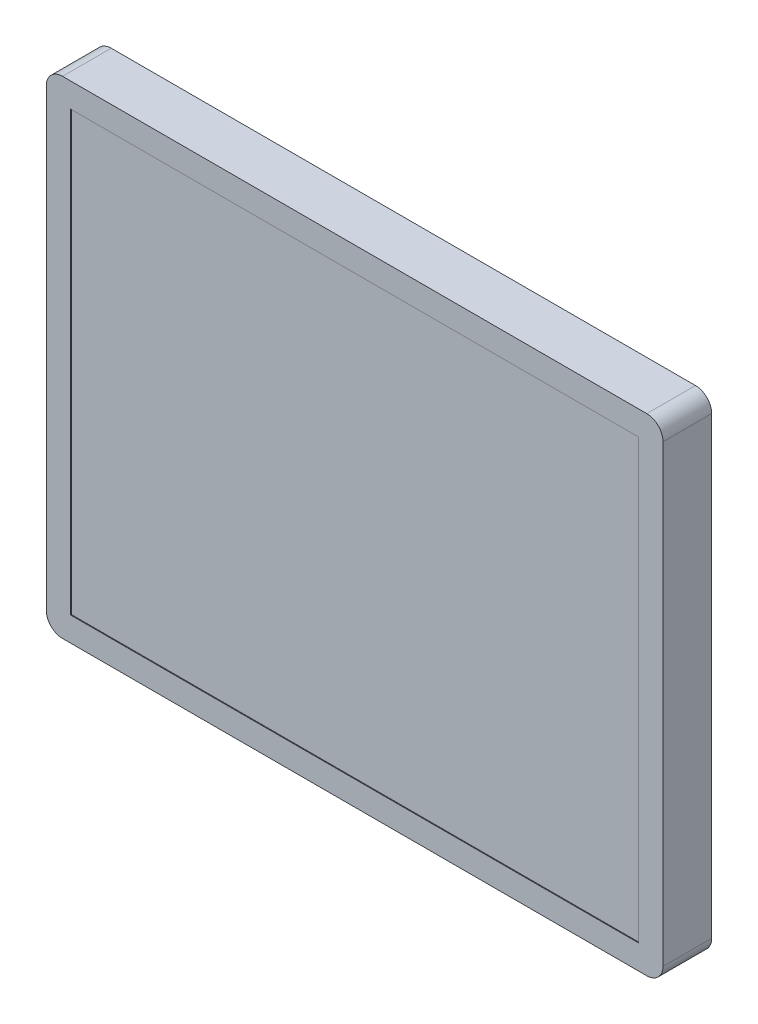
ISO-10303-21;
HEADER;
FILE_DESCRIPTION(('STEP AP214'),'2;1');
FILE_NAME('part.step','',(''),(''),'','','');
FILE_SCHEMA(('AUTOMOTIVE_DESIGN { 1 0 10303 214 1 1 1 1 }'));
ENDSEC;
DATA;
#1=APPLICATION_CONTEXT('core data for automotive mechanical design processes');
#2=APPLICATION_PROTOCOL_DEFINITION('international standard','automotive_design',2000,#1);
#3=PRODUCT_CONTEXT('',#1,'mechanical');
#4=PRODUCT('Part','Part','',(#3));
#5=PRODUCT_RELATED_PRODUCT_CATEGORY('part','',(#4));
#6=PRODUCT_DEFINITION_FORMATION('','',#4);
#7=PRODUCT_DEFINITION_CONTEXT('part definition',#1,'design');
#8=PRODUCT_DEFINITION('design','',#6,#7);
#9=PRODUCT_DEFINITION_SHAPE('','',#8);
#10=(LENGTH_UNIT() NAMED_UNIT(*) SI_UNIT(.MILLI.,.METRE.));
#11=(NAMED_UNIT(*) PLANE_ANGLE_UNIT() SI_UNIT($,.RADIAN.));
#12=(NAMED_UNIT(*) SI_UNIT($,.STERADIAN.) SOLID_ANGLE_UNIT());
#13=UNCERTAINTY_MEASURE_WITH_UNIT(LENGTH_MEASURE(1.E-05),#10,'distance_accuracy_value','');
#14=(GEOMETRIC_REPRESENTATION_CONTEXT(3) GLOBAL_UNCERTAINTY_ASSIGNED_CONTEXT((#13)) GLOBAL_UNIT_ASSIGNED_CONTEXT((#10,
#11,#12)) REPRESENTATION_CONTEXT('',''));
#15=CARTESIAN_POINT('',(0.,0.,0.));
#16=DIRECTION('',(0.,0.,1.));
#17=DIRECTION('',(1.,0.,0.));
#18=AXIS2_PLACEMENT_3D('',#15,#16,#17);
#19=CARTESIAN_POINT('',(0.,0.,30.));
#20=DIRECTION('',(1.,0.,0.));
#21=DIRECTION('',(0.,0.,-1.));
#22=AXIS2_PLACEMENT_3D('',#19,#20,#21);
#23=PLANE('',#22);
#24=DIRECTION('',(0.,-1.,0.));
#25=VECTOR('',#24,1.);
#26=CARTESIAN_POINT('',(0.,0.,0.));
#27=LINE('',#26,#25);
#28=CARTESIAN_POINT('',(0.,290.,0.));
#29=VERTEX_POINT('',#28);
#30=CARTESIAN_POINT('',(0.,10.,0.));
#31=VERTEX_POINT('',#30);
#32=EDGE_CURVE('E165',#29,#31,#27,.T.);
#33=ORIENTED_EDGE('',*,*,#32,.T.);
#34=DIRECTION('',(0.,0.,-1.));
#35=VECTOR('',#34,1.);
#36=CARTESIAN_POINT('',(0.,10.,30.));
#37=LINE('',#36,#35);
#38=CARTESIAN_POINT('',(0.,10.,30.));
#39=VERTEX_POINT('',#38);
#40=EDGE_CURVE('E217',#31,#39,#37,.F.);
#41=ORIENTED_EDGE('',*,*,#40,.T.);
#42=DIRECTION('',(0.,-1.,0.));
#43=VECTOR('',#42,1.);
#44=CARTESIAN_POINT('',(0.,0.,30.));
#45=LINE('',#44,#43);
#46=CARTESIAN_POINT('',(0.,290.,30.));
#47=VERTEX_POINT('',#46);
#48=EDGE_CURVE('E169',#47,#39,#45,.T.);
#49=ORIENTED_EDGE('',*,*,#48,.F.);
#50=DIRECTION('',(0.,0.,-1.));
#51=VECTOR('',#50,1.);
#52=CARTESIAN_POINT('',(0.,290.,30.));
#53=LINE('',#52,#51);
#54=EDGE_CURVE('E214',#47,#29,#53,.T.);
#55=ORIENTED_EDGE('',*,*,#54,.T.);
#56=EDGE_LOOP('',(#33,#41,#49,#55));
#57=FACE_BOUND('',#56,.T.);
#58=ADVANCED_FACE('F37',(#57),#23,.F.);
#59=CARTESIAN_POINT('',(0.,0.,30.));
#60=DIRECTION('',(0.,1.,0.));
#61=DIRECTION('',(0.,0.,1.));
#62=AXIS2_PLACEMENT_3D('',#59,#60,#61);
#63=PLANE('',#62);
#64=DIRECTION('',(1.,0.,0.));
#65=VECTOR('',#64,1.);
#66=CARTESIAN_POINT('',(0.,0.,0.));
#67=LINE('',#66,#65);
#68=CARTESIAN_POINT('',(10.,0.,0.));
#69=VERTEX_POINT('',#68);
#70=CARTESIAN_POINT('',(370.,0.,0.));
#71=VERTEX_POINT('',#70);
#72=EDGE_CURVE('E183',#69,#71,#67,.T.);
#73=ORIENTED_EDGE('',*,*,#72,.T.);
#74=DIRECTION('',(0.,0.,-1.));
#75=VECTOR('',#74,1.);
#76=CARTESIAN_POINT('',(370.,0.,30.));
#77=LINE('',#76,#75);
#78=CARTESIAN_POINT('',(370.,0.,30.));
#79=VERTEX_POINT('',#78);
#80=EDGE_CURVE('E205',#71,#79,#77,.F.);
#81=ORIENTED_EDGE('',*,*,#80,.T.);
#82=DIRECTION('',(1.,0.,0.));
#83=VECTOR('',#82,1.);
#84=CARTESIAN_POINT('',(0.,0.,30.));
#85=LINE('',#84,#83);
#86=CARTESIAN_POINT('',(10.,0.,30.));
#87=VERTEX_POINT('',#86);
#88=EDGE_CURVE('E172',#87,#79,#85,.T.);
#89=ORIENTED_EDGE('',*,*,#88,.F.);
#90=DIRECTION('',(0.,0.,-1.));
#91=VECTOR('',#90,1.);
#92=CARTESIAN_POINT('',(10.,0.,30.));
#93=LINE('',#92,#91);
#94=EDGE_CURVE('E202',#87,#69,#93,.T.);
#95=ORIENTED_EDGE('',*,*,#94,.T.);
#96=EDGE_LOOP('',(#73,#81,#89,#95));
#97=FACE_BOUND('',#96,.T.);
#98=ADVANCED_FACE('F242',(#97),#63,.F.);
#99=CARTESIAN_POINT('',(380.,0.,30.));
#100=DIRECTION('',(-1.,0.,0.));
#101=DIRECTION('',(0.,0.,1.));
#102=AXIS2_PLACEMENT_3D('',#99,#100,#101);
#103=PLANE('',#102);
#104=DIRECTION('',(0.,1.,0.));
#105=VECTOR('',#104,1.);
#106=CARTESIAN_POINT('',(380.,0.,30.));
#107=LINE('',#106,#105);
#108=CARTESIAN_POINT('',(380.,10.,30.));
#109=VERTEX_POINT('',#108);
#110=CARTESIAN_POINT('',(380.,290.,30.));
#111=VERTEX_POINT('',#110);
#112=EDGE_CURVE('E176',#109,#111,#107,.T.);
#113=ORIENTED_EDGE('',*,*,#112,.F.);
#114=DIRECTION('',(0.,0.,-1.));
#115=VECTOR('',#114,1.);
#116=CARTESIAN_POINT('',(380.,10.,30.));
#117=LINE('',#116,#115);
#118=CARTESIAN_POINT('',(380.,10.,0.));
#119=VERTEX_POINT('',#118);
#120=EDGE_CURVE('E191',#109,#119,#117,.T.);
#121=ORIENTED_EDGE('',*,*,#120,.T.);
#122=DIRECTION('',(0.,1.,0.));
#123=VECTOR('',#122,1.);
#124=CARTESIAN_POINT('',(380.,0.,0.));
#125=LINE('',#124,#123);
#126=CARTESIAN_POINT('',(380.,290.,0.));
#127=VERTEX_POINT('',#126);
#128=EDGE_CURVE('E186',#119,#127,#125,.T.);
#129=ORIENTED_EDGE('',*,*,#128,.T.);
#130=DIRECTION('',(0.,0.,-1.));
#131=VECTOR('',#130,1.);
#132=CARTESIAN_POINT('',(380.,290.,30.));
#133=LINE('',#132,#131);
#134=EDGE_CURVE('E180',#127,#111,#133,.F.);
#135=ORIENTED_EDGE('',*,*,#134,.T.);
#136=EDGE_LOOP('',(#113,#121,#129,#135));
#137=FACE_BOUND('',#136,.T.);
#138=ADVANCED_FACE('F250',(#137),#103,.F.);
#139=CARTESIAN_POINT('',(0.,300.,30.));
#140=DIRECTION('',(0.,-1.,0.));
#141=DIRECTION('',(0.,0.,-1.));
#142=AXIS2_PLACEMENT_3D('',#139,#140,#141);
#143=PLANE('',#142);
#144=DIRECTION('',(-1.,0.,0.));
#145=VECTOR('',#144,1.);
#146=CARTESIAN_POINT('',(0.,300.,0.));
#147=LINE('',#146,#145);
#148=CARTESIAN_POINT('',(370.,300.,0.));
#149=VERTEX_POINT('',#148);
#150=CARTESIAN_POINT('',(10.,300.,0.));
#151=VERTEX_POINT('',#150);
#152=EDGE_CURVE('E173',#149,#151,#147,.T.);
#153=ORIENTED_EDGE('',*,*,#152,.T.);
#154=DIRECTION('',(0.,0.,-1.));
#155=VECTOR('',#154,1.);
#156=CARTESIAN_POINT('',(10.,300.,30.));
#157=LINE('',#156,#155);
#158=CARTESIAN_POINT('',(10.,300.,30.));
#159=VERTEX_POINT('',#158);
#160=EDGE_CURVE('E11',#151,#159,#157,.F.);
#161=ORIENTED_EDGE('',*,*,#160,.T.);
#162=DIRECTION('',(-1.,0.,0.));
#163=VECTOR('',#162,1.);
#164=CARTESIAN_POINT('',(0.,300.,30.));
#165=LINE('',#164,#163);
#166=CARTESIAN_POINT('',(370.,300.,30.));
#167=VERTEX_POINT('',#166);
#168=EDGE_CURVE('E178',#167,#159,#165,.T.);
#169=ORIENTED_EDGE('',*,*,#168,.F.);
#170=DIRECTION('',(0.,0.,-1.));
#171=VECTOR('',#170,1.);
#172=CARTESIAN_POINT('',(370.,300.,30.));
#173=LINE('',#172,#171);
#174=EDGE_CURVE('E45',#167,#149,#173,.T.);
#175=ORIENTED_EDGE('',*,*,#174,.T.);
#176=EDGE_LOOP('',(#153,#161,#169,#175));
#177=FACE_BOUND('',#176,.T.);
#178=ADVANCED_FACE('F221',(#177),#143,.F.);
#179=CARTESIAN_POINT('',(0.,300.,30.));
#180=DIRECTION('',(0.,0.,-1.));
#181=DIRECTION('',(-1.,0.,0.));
#182=AXIS2_PLACEMENT_3D('',#179,#180,#181);
#183=PLANE('',#182);
#184=DIRECTION('',(1.,0.,0.));
#185=VECTOR('',#184,1.);
#186=CARTESIAN_POINT('',(15.,15.,30.));
#187=LINE('',#186,#185);
#188=CARTESIAN_POINT('',(15.,15.,30.));
#189=VERTEX_POINT('',#188);
#190=CARTESIAN_POINT('',(365.,15.,30.));
#191=VERTEX_POINT('',#190);
#192=EDGE_CURVE('E159',#189,#191,#187,.T.);
#193=ORIENTED_EDGE('',*,*,#192,.F.);
#194=DIRECTION('',(0.,-1.,0.));
#195=VECTOR('',#194,1.);
#196=CARTESIAN_POINT('',(15.,285.,30.));
#197=LINE('',#196,#195);
#198=CARTESIAN_POINT('',(15.,285.,30.));
#199=VERTEX_POINT('',#198);
#200=EDGE_CURVE('E133',#199,#189,#197,.T.);
#201=ORIENTED_EDGE('',*,*,#200,.F.);
#202=DIRECTION('',(-1.,0.,0.));
#203=VECTOR('',#202,1.);
#204=CARTESIAN_POINT('',(15.,285.,30.));
#205=LINE('',#204,#203);
#206=CARTESIAN_POINT('',(365.,285.,30.));
#207=VERTEX_POINT('',#206);
#208=EDGE_CURVE('E150',#207,#199,#205,.T.);
#209=ORIENTED_EDGE('',*,*,#208,.F.);
#210=DIRECTION('',(0.,1.,0.));
#211=VECTOR('',#210,1.);
#212=CARTESIAN_POINT('',(365.,285.,30.));
#213=LINE('',#212,#211);
#214=EDGE_CURVE('E153',#191,#207,#213,.T.);
#215=ORIENTED_EDGE('',*,*,#214,.F.);
#216=EDGE_LOOP('',(#193,#201,#209,#215));
#217=FACE_BOUND('',#216,.T.);
#218=ORIENTED_EDGE('',*,*,#88,.T.);
#219=CARTESIAN_POINT('',(370.,10.,30.));
#220=DIRECTION('',(0.,0.,-1.));
#221=DIRECTION('',(-1.,0.,0.));
#222=AXIS2_PLACEMENT_3D('',#219,#220,#221);
#223=CIRCLE('',#222,10.);
#224=EDGE_CURVE('E212',#79,#109,#223,.F.);
#225=ORIENTED_EDGE('',*,*,#224,.T.);
#226=ORIENTED_EDGE('',*,*,#112,.T.);
#227=CARTESIAN_POINT('',(370.,290.,30.));
#228=DIRECTION('',(0.,0.,-1.));
#229=DIRECTION('',(-1.,0.,0.));
#230=AXIS2_PLACEMENT_3D('',#227,#228,#229);
#231=CIRCLE('',#230,10.);
#232=EDGE_CURVE('E57',#111,#167,#231,.F.);
#233=ORIENTED_EDGE('',*,*,#232,.T.);
#234=ORIENTED_EDGE('',*,*,#168,.T.);
#235=CARTESIAN_POINT('',(10.,290.,30.));
#236=DIRECTION('',(0.,0.,-1.));
#237=DIRECTION('',(-1.,0.,0.));
#238=AXIS2_PLACEMENT_3D('',#235,#236,#237);
#239=CIRCLE('',#238,10.);
#240=EDGE_CURVE('E208',#159,#47,#239,.F.);
#241=ORIENTED_EDGE('',*,*,#240,.T.);
#242=ORIENTED_EDGE('',*,*,#48,.T.);
#243=CARTESIAN_POINT('',(10.,10.,30.));
#244=DIRECTION('',(0.,0.,-1.));
#245=DIRECTION('',(-1.,0.,0.));
#246=AXIS2_PLACEMENT_3D('',#243,#244,#245);
#247=CIRCLE('',#246,10.);
#248=EDGE_CURVE('E210',#39,#87,#247,.F.);
#249=ORIENTED_EDGE('',*,*,#248,.T.);
#250=EDGE_LOOP('',(#218,#225,#226,#233,#234,#241,#242,#249));
#251=FACE_BOUND('',#250,.T.);
#252=ADVANCED_FACE('F235',(#217,#251),#183,.F.);
#253=CARTESIAN_POINT('',(0.,300.,0.));
#254=DIRECTION('',(0.,0.,-1.));
#255=DIRECTION('',(-1.,0.,0.));
#256=AXIS2_PLACEMENT_3D('',#253,#254,#255);
#257=PLANE('',#256);
#258=ORIENTED_EDGE('',*,*,#128,.F.);
#259=CARTESIAN_POINT('',(370.,10.,0.));
#260=DIRECTION('',(0.,0.,-1.));
#261=DIRECTION('',(-1.,0.,0.));
#262=AXIS2_PLACEMENT_3D('',#259,#260,#261);
#263=CIRCLE('',#262,10.);
#264=EDGE_CURVE('E200',#119,#71,#263,.T.);
#265=ORIENTED_EDGE('',*,*,#264,.T.);
#266=ORIENTED_EDGE('',*,*,#72,.F.);
#267=CARTESIAN_POINT('',(10.,10.,0.));
#268=DIRECTION('',(0.,0.,-1.));
#269=DIRECTION('',(-1.,0.,0.));
#270=AXIS2_PLACEMENT_3D('',#267,#268,#269);
#271=CIRCLE('',#270,10.);
#272=EDGE_CURVE('E198',#69,#31,#271,.T.);
#273=ORIENTED_EDGE('',*,*,#272,.T.);
#274=ORIENTED_EDGE('',*,*,#32,.F.);
#275=CARTESIAN_POINT('',(10.,290.,0.));
#276=DIRECTION('',(0.,0.,-1.));
#277=DIRECTION('',(-1.,0.,0.));
#278=AXIS2_PLACEMENT_3D('',#275,#276,#277);
#279=CIRCLE('',#278,10.);
#280=EDGE_CURVE('E196',#29,#151,#279,.T.);
#281=ORIENTED_EDGE('',*,*,#280,.T.);
#282=ORIENTED_EDGE('',*,*,#152,.F.);
#283=CARTESIAN_POINT('',(370.,290.,0.));
#284=DIRECTION('',(0.,0.,-1.));
#285=DIRECTION('',(-1.,0.,0.));
#286=AXIS2_PLACEMENT_3D('',#283,#284,#285);
#287=CIRCLE('',#286,10.);
#288=EDGE_CURVE('E194',#149,#127,#287,.T.);
#289=ORIENTED_EDGE('',*,*,#288,.T.);
#290=EDGE_LOOP('',(#258,#265,#266,#273,#274,#281,#282,#289));
#291=FACE_BOUND('',#290,.T.);
#292=ADVANCED_FACE('F225',(#291),#257,.T.);
#293=CARTESIAN_POINT('',(15.,285.,29.5));
#294=DIRECTION('',(-1.,0.,0.));
#295=DIRECTION('',(0.,-1.,0.));
#296=AXIS2_PLACEMENT_3D('',#293,#294,#295);
#297=PLANE('',#296);
#298=ORIENTED_EDGE('',*,*,#200,.T.);
#299=DIRECTION('',(0.,0.,1.));
#300=VECTOR('',#299,1.);
#301=CARTESIAN_POINT('',(15.,15.,29.5));
#302=LINE('',#301,#300);
#303=CARTESIAN_POINT('',(15.,15.,29.5));
#304=VERTEX_POINT('',#303);
#305=EDGE_CURVE('E126',#304,#189,#302,.T.);
#306=ORIENTED_EDGE('',*,*,#305,.F.);
#307=DIRECTION('',(0.,-1.,0.));
#308=VECTOR('',#307,1.);
#309=CARTESIAN_POINT('',(15.,285.,29.5));
#310=LINE('',#309,#308);
#311=CARTESIAN_POINT('',(15.,285.,29.5));
#312=VERTEX_POINT('',#311);
#313=EDGE_CURVE('E130',#312,#304,#310,.T.);
#314=ORIENTED_EDGE('',*,*,#313,.F.);
#315=DIRECTION('',(0.,0.,1.));
#316=VECTOR('',#315,1.);
#317=CARTESIAN_POINT('',(15.,285.,29.5));
#318=LINE('',#317,#316);
#319=EDGE_CURVE('E163',#312,#199,#318,.T.);
#320=ORIENTED_EDGE('',*,*,#319,.T.);
#321=EDGE_LOOP('',(#298,#306,#314,#320));
#322=FACE_BOUND('',#321,.T.);
#323=ADVANCED_FACE('F128',(#322),#297,.F.);
#324=CARTESIAN_POINT('',(15.,285.,29.5));
#325=DIRECTION('',(0.,1.,0.));
#326=DIRECTION('',(0.,0.,1.));
#327=AXIS2_PLACEMENT_3D('',#324,#325,#326);
#328=PLANE('',#327);
#329=ORIENTED_EDGE('',*,*,#208,.T.);
#330=ORIENTED_EDGE('',*,*,#319,.F.);
#331=DIRECTION('',(-1.,0.,0.));
#332=VECTOR('',#331,1.);
#333=CARTESIAN_POINT('',(15.,285.,29.5));
#334=LINE('',#333,#332);
#335=CARTESIAN_POINT('',(365.,285.,29.5));
#336=VERTEX_POINT('',#335);
#337=EDGE_CURVE('E138',#336,#312,#334,.T.);
#338=ORIENTED_EDGE('',*,*,#337,.F.);
#339=DIRECTION('',(0.,0.,1.));
#340=VECTOR('',#339,1.);
#341=CARTESIAN_POINT('',(365.,285.,29.5));
#342=LINE('',#341,#340);
#343=EDGE_CURVE('E166',#336,#207,#342,.T.);
#344=ORIENTED_EDGE('',*,*,#343,.T.);
#345=EDGE_LOOP('',(#329,#330,#338,#344));
#346=FACE_BOUND('',#345,.T.);
#347=ADVANCED_FACE('F312',(#346),#328,.F.);
#348=CARTESIAN_POINT('',(365.,285.,29.5));
#349=DIRECTION('',(1.,0.,0.));
#350=DIRECTION('',(0.,1.,0.));
#351=AXIS2_PLACEMENT_3D('',#348,#349,#350);
#352=PLANE('',#351);
#353=ORIENTED_EDGE('',*,*,#214,.T.);
#354=ORIENTED_EDGE('',*,*,#343,.F.);
#355=DIRECTION('',(0.,1.,0.));
#356=VECTOR('',#355,1.);
#357=CARTESIAN_POINT('',(365.,285.,29.5));
#358=LINE('',#357,#356);
#359=CARTESIAN_POINT('',(365.,15.,29.5));
#360=VERTEX_POINT('',#359);
#361=EDGE_CURVE('E146',#360,#336,#358,.T.);
#362=ORIENTED_EDGE('',*,*,#361,.F.);
#363=DIRECTION('',(0.,0.,1.));
#364=VECTOR('',#363,1.);
#365=CARTESIAN_POINT('',(365.,15.,29.5));
#366=LINE('',#365,#364);
#367=EDGE_CURVE('E137',#360,#191,#366,.T.);
#368=ORIENTED_EDGE('',*,*,#367,.T.);
#369=EDGE_LOOP('',(#353,#354,#362,#368));
#370=FACE_BOUND('',#369,.T.);
#371=ADVANCED_FACE('F304',(#370),#352,.F.);
#372=CARTESIAN_POINT('',(15.,15.,29.5));
#373=DIRECTION('',(0.,-1.,0.));
#374=DIRECTION('',(0.,0.,-1.));
#375=AXIS2_PLACEMENT_3D('',#372,#373,#374);
#376=PLANE('',#375);
#377=ORIENTED_EDGE('',*,*,#192,.T.);
#378=ORIENTED_EDGE('',*,*,#367,.F.);
#379=DIRECTION('',(1.,0.,0.));
#380=VECTOR('',#379,1.);
#381=CARTESIAN_POINT('',(15.,15.,29.5));
#382=LINE('',#381,#380);
#383=EDGE_CURVE('E141',#304,#360,#382,.T.);
#384=ORIENTED_EDGE('',*,*,#383,.F.);
#385=ORIENTED_EDGE('',*,*,#305,.T.);
#386=EDGE_LOOP('',(#377,#378,#384,#385));
#387=FACE_BOUND('',#386,.T.);
#388=ADVANCED_FACE('F142',(#387),#376,.F.);
#389=CARTESIAN_POINT('',(15.,15.,29.5));
#390=DIRECTION('',(0.,0.,1.));
#391=DIRECTION('',(1.,0.,0.));
#392=AXIS2_PLACEMENT_3D('',#389,#390,#391);
#393=PLANE('',#392);
#394=ORIENTED_EDGE('',*,*,#313,.T.);
#395=ORIENTED_EDGE('',*,*,#383,.T.);
#396=ORIENTED_EDGE('',*,*,#361,.T.);
#397=ORIENTED_EDGE('',*,*,#337,.T.);
#398=EDGE_LOOP('',(#394,#395,#396,#397));
#399=FACE_BOUND('',#398,.T.);
#400=ADVANCED_FACE('F148',(#399),#393,.T.);
#401=CARTESIAN_POINT('',(370.,10.,30.));
#402=DIRECTION('',(0.,0.,-1.));
#403=DIRECTION('',(-1.,0.,0.));
#404=AXIS2_PLACEMENT_3D('',#401,#402,#403);
#405=CYLINDRICAL_SURFACE('',#404,10.);
#406=ORIENTED_EDGE('',*,*,#224,.F.);
#407=ORIENTED_EDGE('',*,*,#80,.F.);
#408=ORIENTED_EDGE('',*,*,#264,.F.);
#409=ORIENTED_EDGE('',*,*,#120,.F.);
#410=EDGE_LOOP('',(#406,#407,#408,#409));
#411=FACE_BOUND('',#410,.T.);
#412=ADVANCED_FACE('F247',(#411),#405,.T.);
#413=CARTESIAN_POINT('',(10.,10.,30.));
#414=DIRECTION('',(0.,0.,-1.));
#415=DIRECTION('',(-1.,0.,0.));
#416=AXIS2_PLACEMENT_3D('',#413,#414,#415);
#417=CYLINDRICAL_SURFACE('',#416,10.);
#418=ORIENTED_EDGE('',*,*,#248,.F.);
#419=ORIENTED_EDGE('',*,*,#40,.F.);
#420=ORIENTED_EDGE('',*,*,#272,.F.);
#421=ORIENTED_EDGE('',*,*,#94,.F.);
#422=EDGE_LOOP('',(#418,#419,#420,#421));
#423=FACE_BOUND('',#422,.T.);
#424=ADVANCED_FACE('F239',(#423),#417,.T.);
#425=CARTESIAN_POINT('',(10.,290.,30.));
#426=DIRECTION('',(0.,0.,-1.));
#427=DIRECTION('',(-1.,0.,0.));
#428=AXIS2_PLACEMENT_3D('',#425,#426,#427);
#429=CYLINDRICAL_SURFACE('',#428,10.);
#430=ORIENTED_EDGE('',*,*,#240,.F.);
#431=ORIENTED_EDGE('',*,*,#160,.F.);
#432=ORIENTED_EDGE('',*,*,#280,.F.);
#433=ORIENTED_EDGE('',*,*,#54,.F.);
#434=EDGE_LOOP('',(#430,#431,#432,#433));
#435=FACE_BOUND('',#434,.T.);
#436=ADVANCED_FACE('F230',(#435),#429,.T.);
#437=CARTESIAN_POINT('',(370.,290.,30.));
#438=DIRECTION('',(0.,0.,-1.));
#439=DIRECTION('',(-1.,0.,0.));
#440=AXIS2_PLACEMENT_3D('',#437,#438,#439);
#441=CYLINDRICAL_SURFACE('',#440,10.);
#442=ORIENTED_EDGE('',*,*,#232,.F.);
#443=ORIENTED_EDGE('',*,*,#134,.F.);
#444=ORIENTED_EDGE('',*,*,#288,.F.);
#445=ORIENTED_EDGE('',*,*,#174,.F.);
#446=EDGE_LOOP('',(#442,#443,#444,#445));
#447=FACE_BOUND('',#446,.T.);
#448=ADVANCED_FACE('F39',(#447),#441,.T.);
#449=CLOSED_SHELL('',(#58,#98,#138,#178,#252,#292,#323,#347,#371,#388,#400,#412,#424,#436,#448));
#450=MANIFOLD_SOLID_BREP('B2',#449);
#451=ADVANCED_BREP_SHAPE_REPRESENTATION('',(#18,#450),#14);
#452=SHAPE_DEFINITION_REPRESENTATION(#9,#451);
ENDSEC;
END-ISO-10303-21;
